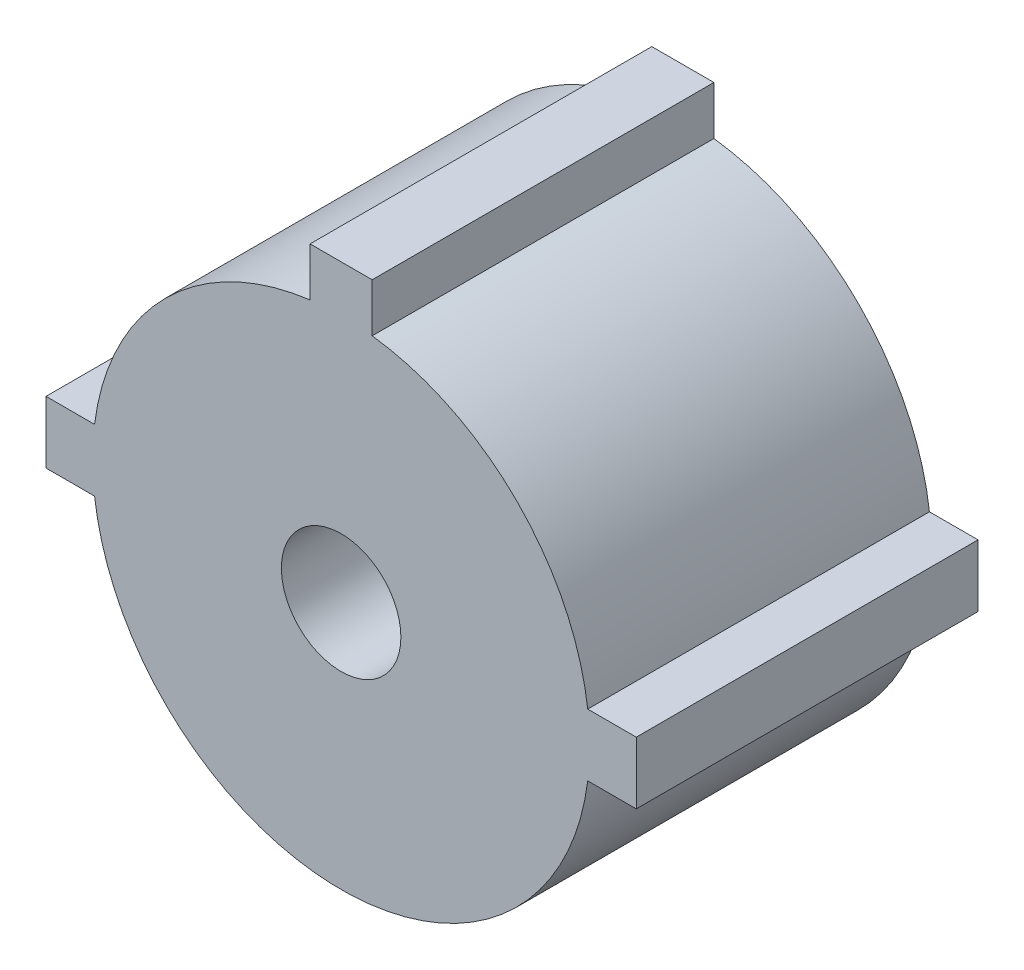
ISO-10303-21;
HEADER;
FILE_DESCRIPTION(('STEP AP214'),'2;1');
FILE_NAME('part.step','',(''),(''),'','','');
FILE_SCHEMA(('AUTOMOTIVE_DESIGN { 1 0 10303 214 1 1 1 1 }'));
ENDSEC;
DATA;
#1=APPLICATION_CONTEXT('core data for automotive mechanical design processes');
#2=APPLICATION_PROTOCOL_DEFINITION('international standard','automotive_design',2000,#1);
#3=PRODUCT_CONTEXT('',#1,'mechanical');
#4=PRODUCT('Part','Part','',(#3));
#5=PRODUCT_RELATED_PRODUCT_CATEGORY('part','',(#4));
#6=PRODUCT_DEFINITION_FORMATION('','',#4);
#7=PRODUCT_DEFINITION_CONTEXT('part definition',#1,'design');
#8=PRODUCT_DEFINITION('design','',#6,#7);
#9=PRODUCT_DEFINITION_SHAPE('','',#8);
#10=(LENGTH_UNIT() NAMED_UNIT(*) SI_UNIT(.MILLI.,.METRE.));
#11=(NAMED_UNIT(*) PLANE_ANGLE_UNIT() SI_UNIT($,.RADIAN.));
#12=(NAMED_UNIT(*) SI_UNIT($,.STERADIAN.) SOLID_ANGLE_UNIT());
#13=UNCERTAINTY_MEASURE_WITH_UNIT(LENGTH_MEASURE(1.E-05),#10,'distance_accuracy_value','');
#14=(GEOMETRIC_REPRESENTATION_CONTEXT(3) GLOBAL_UNCERTAINTY_ASSIGNED_CONTEXT((#13)) GLOBAL_UNIT_ASSIGNED_CONTEXT((#10,
#11,#12)) REPRESENTATION_CONTEXT('',''));
#15=CARTESIAN_POINT('',(0.,0.,0.));
#16=DIRECTION('',(0.,0.,1.));
#17=DIRECTION('',(1.,0.,0.));
#18=AXIS2_PLACEMENT_3D('',#15,#16,#17);
#19=CARTESIAN_POINT('',(0.,0.,5.5));
#20=DIRECTION('',(0.,0.,-1.));
#21=DIRECTION('',(-1.,0.,0.));
#22=AXIS2_PLACEMENT_3D('',#19,#20,#21);
#23=CYLINDRICAL_SURFACE('',#22,4.);
#24=CARTESIAN_POINT('',(0.,0.,0.));
#25=DIRECTION('',(0.,0.,1.));
#26=DIRECTION('',(1.,0.,0.));
#27=AXIS2_PLACEMENT_3D('',#24,#25,#26);
#28=CIRCLE('',#27,4.);
#29=CARTESIAN_POINT('',(-0.5,3.96862696659689,0.));
#30=VERTEX_POINT('',#29);
#31=CARTESIAN_POINT('',(-3.96862696659689,0.5,0.));
#32=VERTEX_POINT('',#31);
#33=EDGE_CURVE('E157',#30,#32,#28,.T.);
#34=ORIENTED_EDGE('',*,*,#33,.T.);
#35=DIRECTION('',(0.,0.,-1.));
#36=VECTOR('',#35,1.);
#37=CARTESIAN_POINT('',(-3.96862696659689,0.5,5.5));
#38=LINE('',#37,#36);
#39=CARTESIAN_POINT('',(-3.96862696659689,0.5,5.5));
#40=VERTEX_POINT('',#39);
#41=EDGE_CURVE('E11',#40,#32,#38,.T.);
#42=ORIENTED_EDGE('',*,*,#41,.F.);
#43=CARTESIAN_POINT('',(0.,0.,5.5));
#44=DIRECTION('',(0.,0.,1.));
#45=DIRECTION('',(1.,0.,0.));
#46=AXIS2_PLACEMENT_3D('',#43,#44,#45);
#47=CIRCLE('',#46,4.);
#48=CARTESIAN_POINT('',(-0.5,3.96862696659689,5.5));
#49=VERTEX_POINT('',#48);
#50=EDGE_CURVE('E100',#49,#40,#47,.T.);
#51=ORIENTED_EDGE('',*,*,#50,.F.);
#52=DIRECTION('',(0.,0.,-1.));
#53=VECTOR('',#52,1.);
#54=CARTESIAN_POINT('',(-0.5,3.96862696659689,5.5));
#55=LINE('',#54,#53);
#56=EDGE_CURVE('E150',#49,#30,#55,.T.);
#57=ORIENTED_EDGE('',*,*,#56,.T.);
#58=EDGE_LOOP('',(#34,#42,#51,#57));
#59=FACE_BOUND('',#58,.T.);
#60=ADVANCED_FACE('F35',(#59),#23,.T.);
#61=CARTESIAN_POINT('',(0.,0.5,5.5));
#62=DIRECTION('',(0.,1.,0.));
#63=DIRECTION('',(0.,0.,1.));
#64=AXIS2_PLACEMENT_3D('',#61,#62,#63);
#65=PLANE('',#64);
#66=DIRECTION('',(1.,0.,0.));
#67=VECTOR('',#66,1.);
#68=CARTESIAN_POINT('',(0.,0.5,0.));
#69=LINE('',#68,#67);
#70=CARTESIAN_POINT('',(-4.75,0.5,0.));
#71=VERTEX_POINT('',#70);
#72=EDGE_CURVE('E160',#71,#32,#69,.T.);
#73=ORIENTED_EDGE('',*,*,#72,.F.);
#74=DIRECTION('',(0.,0.,-1.));
#75=VECTOR('',#74,1.);
#76=CARTESIAN_POINT('',(-4.75,0.5,5.5));
#77=LINE('',#76,#75);
#78=CARTESIAN_POINT('',(-4.75,0.5,5.5));
#79=VERTEX_POINT('',#78);
#80=EDGE_CURVE('E44',#79,#71,#77,.T.);
#81=ORIENTED_EDGE('',*,*,#80,.F.);
#82=DIRECTION('',(1.,0.,0.));
#83=VECTOR('',#82,1.);
#84=CARTESIAN_POINT('',(0.,0.5,5.5));
#85=LINE('',#84,#83);
#86=EDGE_CURVE('E218',#79,#40,#85,.T.);
#87=ORIENTED_EDGE('',*,*,#86,.T.);
#88=ORIENTED_EDGE('',*,*,#41,.T.);
#89=EDGE_LOOP('',(#73,#81,#87,#88));
#90=FACE_BOUND('',#89,.T.);
#91=ADVANCED_FACE('F217',(#90),#65,.T.);
#92=CARTESIAN_POINT('',(-4.75,0.,5.5));
#93=DIRECTION('',(1.,0.,0.));
#94=DIRECTION('',(0.,0.,-1.));
#95=AXIS2_PLACEMENT_3D('',#92,#93,#94);
#96=PLANE('',#95);
#97=DIRECTION('',(0.,-1.,0.));
#98=VECTOR('',#97,1.);
#99=CARTESIAN_POINT('',(-4.75,0.,0.));
#100=LINE('',#99,#98);
#101=CARTESIAN_POINT('',(-4.75,-0.5,0.));
#102=VERTEX_POINT('',#101);
#103=EDGE_CURVE('E163',#71,#102,#100,.T.);
#104=ORIENTED_EDGE('',*,*,#103,.T.);
#105=DIRECTION('',(0.,0.,-1.));
#106=VECTOR('',#105,1.);
#107=CARTESIAN_POINT('',(-4.75,-0.5,5.5));
#108=LINE('',#107,#106);
#109=CARTESIAN_POINT('',(-4.75,-0.5,5.5));
#110=VERTEX_POINT('',#109);
#111=EDGE_CURVE('E201',#110,#102,#108,.T.);
#112=ORIENTED_EDGE('',*,*,#111,.F.);
#113=DIRECTION('',(0.,-1.,0.));
#114=VECTOR('',#113,1.);
#115=CARTESIAN_POINT('',(-4.75,0.,5.5));
#116=LINE('',#115,#114);
#117=EDGE_CURVE('E208',#79,#110,#116,.T.);
#118=ORIENTED_EDGE('',*,*,#117,.F.);
#119=ORIENTED_EDGE('',*,*,#80,.T.);
#120=EDGE_LOOP('',(#104,#112,#118,#119));
#121=FACE_BOUND('',#120,.T.);
#122=ADVANCED_FACE('F206',(#121),#96,.F.);
#123=CARTESIAN_POINT('',(0.,-0.5,5.5));
#124=DIRECTION('',(0.,1.,0.));
#125=DIRECTION('',(0.,0.,1.));
#126=AXIS2_PLACEMENT_3D('',#123,#124,#125);
#127=PLANE('',#126);
#128=DIRECTION('',(1.,0.,0.));
#129=VECTOR('',#128,1.);
#130=CARTESIAN_POINT('',(0.,-0.5,0.));
#131=LINE('',#130,#129);
#132=CARTESIAN_POINT('',(-3.96862696659689,-0.5,0.));
#133=VERTEX_POINT('',#132);
#134=EDGE_CURVE('E165',#102,#133,#131,.T.);
#135=ORIENTED_EDGE('',*,*,#134,.T.);
#136=DIRECTION('',(0.,0.,-1.));
#137=VECTOR('',#136,1.);
#138=CARTESIAN_POINT('',(-3.96862696659689,-0.5,5.5));
#139=LINE('',#138,#137);
#140=CARTESIAN_POINT('',(-3.96862696659689,-0.5,5.5));
#141=VERTEX_POINT('',#140);
#142=EDGE_CURVE('E198',#141,#133,#139,.T.);
#143=ORIENTED_EDGE('',*,*,#142,.F.);
#144=DIRECTION('',(1.,0.,0.));
#145=VECTOR('',#144,1.);
#146=CARTESIAN_POINT('',(0.,-0.5,5.5));
#147=LINE('',#146,#145);
#148=EDGE_CURVE('E247',#110,#141,#147,.T.);
#149=ORIENTED_EDGE('',*,*,#148,.F.);
#150=ORIENTED_EDGE('',*,*,#111,.T.);
#151=EDGE_LOOP('',(#135,#143,#149,#150));
#152=FACE_BOUND('',#151,.T.);
#153=ADVANCED_FACE('F246',(#152),#127,.F.);
#154=CARTESIAN_POINT('',(0.,0.,5.5));
#155=DIRECTION('',(0.,0.,-1.));
#156=DIRECTION('',(-1.,0.,0.));
#157=AXIS2_PLACEMENT_3D('',#154,#155,#156);
#158=CYLINDRICAL_SURFACE('',#157,4.);
#159=CARTESIAN_POINT('',(0.,0.,0.));
#160=DIRECTION('',(0.,0.,1.));
#161=DIRECTION('',(1.,0.,0.));
#162=AXIS2_PLACEMENT_3D('',#159,#160,#161);
#163=CIRCLE('',#162,4.);
#164=CARTESIAN_POINT('',(3.96862696659689,-0.5,0.));
#165=VERTEX_POINT('',#164);
#166=EDGE_CURVE('E167',#133,#165,#163,.T.);
#167=ORIENTED_EDGE('',*,*,#166,.T.);
#168=DIRECTION('',(0.,0.,-1.));
#169=VECTOR('',#168,1.);
#170=CARTESIAN_POINT('',(3.96862696659689,-0.5,5.5));
#171=LINE('',#170,#169);
#172=CARTESIAN_POINT('',(3.96862696659689,-0.5,5.5));
#173=VERTEX_POINT('',#172);
#174=EDGE_CURVE('E195',#173,#165,#171,.T.);
#175=ORIENTED_EDGE('',*,*,#174,.F.);
#176=CARTESIAN_POINT('',(0.,0.,5.5));
#177=DIRECTION('',(0.,0.,1.));
#178=DIRECTION('',(1.,0.,0.));
#179=AXIS2_PLACEMENT_3D('',#176,#177,#178);
#180=CIRCLE('',#179,4.);
#181=EDGE_CURVE('E242',#141,#173,#180,.T.);
#182=ORIENTED_EDGE('',*,*,#181,.F.);
#183=ORIENTED_EDGE('',*,*,#142,.T.);
#184=EDGE_LOOP('',(#167,#175,#182,#183));
#185=FACE_BOUND('',#184,.T.);
#186=ADVANCED_FACE('F241',(#185),#158,.T.);
#187=CARTESIAN_POINT('',(0.,-0.5,5.5));
#188=DIRECTION('',(0.,1.,0.));
#189=DIRECTION('',(0.,0.,1.));
#190=AXIS2_PLACEMENT_3D('',#187,#188,#189);
#191=PLANE('',#190);
#192=DIRECTION('',(1.,0.,0.));
#193=VECTOR('',#192,1.);
#194=CARTESIAN_POINT('',(0.,-0.5,0.));
#195=LINE('',#194,#193);
#196=CARTESIAN_POINT('',(4.75,-0.5,0.));
#197=VERTEX_POINT('',#196);
#198=EDGE_CURVE('E169',#165,#197,#195,.T.);
#199=ORIENTED_EDGE('',*,*,#198,.T.);
#200=DIRECTION('',(0.,0.,-1.));
#201=VECTOR('',#200,1.);
#202=CARTESIAN_POINT('',(4.75,-0.5,5.5));
#203=LINE('',#202,#201);
#204=CARTESIAN_POINT('',(4.75,-0.5,5.5));
#205=VERTEX_POINT('',#204);
#206=EDGE_CURVE('E193',#205,#197,#203,.T.);
#207=ORIENTED_EDGE('',*,*,#206,.F.);
#208=DIRECTION('',(1.,0.,0.));
#209=VECTOR('',#208,1.);
#210=CARTESIAN_POINT('',(0.,-0.5,5.5));
#211=LINE('',#210,#209);
#212=EDGE_CURVE('E238',#173,#205,#211,.T.);
#213=ORIENTED_EDGE('',*,*,#212,.F.);
#214=ORIENTED_EDGE('',*,*,#174,.T.);
#215=EDGE_LOOP('',(#199,#207,#213,#214));
#216=FACE_BOUND('',#215,.T.);
#217=ADVANCED_FACE('F235',(#216),#191,.F.);
#218=CARTESIAN_POINT('',(4.75,0.,5.5));
#219=DIRECTION('',(1.,0.,0.));
#220=DIRECTION('',(0.,0.,-1.));
#221=AXIS2_PLACEMENT_3D('',#218,#219,#220);
#222=PLANE('',#221);
#223=DIRECTION('',(0.,-1.,0.));
#224=VECTOR('',#223,1.);
#225=CARTESIAN_POINT('',(4.75,0.,0.));
#226=LINE('',#225,#224);
#227=CARTESIAN_POINT('',(4.75,0.5,0.));
#228=VERTEX_POINT('',#227);
#229=EDGE_CURVE('E172',#228,#197,#226,.T.);
#230=ORIENTED_EDGE('',*,*,#229,.F.);
#231=DIRECTION('',(0.,0.,-1.));
#232=VECTOR('',#231,1.);
#233=CARTESIAN_POINT('',(4.75,0.5,5.5));
#234=LINE('',#233,#232);
#235=CARTESIAN_POINT('',(4.75,0.5,5.5));
#236=VERTEX_POINT('',#235);
#237=EDGE_CURVE('E191',#236,#228,#234,.T.);
#238=ORIENTED_EDGE('',*,*,#237,.F.);
#239=DIRECTION('',(0.,-1.,0.));
#240=VECTOR('',#239,1.);
#241=CARTESIAN_POINT('',(4.75,0.,5.5));
#242=LINE('',#241,#240);
#243=EDGE_CURVE('E254',#236,#205,#242,.T.);
#244=ORIENTED_EDGE('',*,*,#243,.T.);
#245=ORIENTED_EDGE('',*,*,#206,.T.);
#246=EDGE_LOOP('',(#230,#238,#244,#245));
#247=FACE_BOUND('',#246,.T.);
#248=ADVANCED_FACE('F231',(#247),#222,.T.);
#249=CARTESIAN_POINT('',(0.,0.5,5.5));
#250=DIRECTION('',(0.,1.,0.));
#251=DIRECTION('',(0.,0.,1.));
#252=AXIS2_PLACEMENT_3D('',#249,#250,#251);
#253=PLANE('',#252);
#254=DIRECTION('',(1.,0.,0.));
#255=VECTOR('',#254,1.);
#256=CARTESIAN_POINT('',(0.,0.5,0.));
#257=LINE('',#256,#255);
#258=CARTESIAN_POINT('',(3.96862696659689,0.5,0.));
#259=VERTEX_POINT('',#258);
#260=EDGE_CURVE('E175',#259,#228,#257,.T.);
#261=ORIENTED_EDGE('',*,*,#260,.F.);
#262=DIRECTION('',(0.,0.,-1.));
#263=VECTOR('',#262,1.);
#264=CARTESIAN_POINT('',(3.96862696659689,0.5,5.5));
#265=LINE('',#264,#263);
#266=CARTESIAN_POINT('',(3.96862696659689,0.5,5.5));
#267=VERTEX_POINT('',#266);
#268=EDGE_CURVE('E189',#267,#259,#265,.T.);
#269=ORIENTED_EDGE('',*,*,#268,.F.);
#270=DIRECTION('',(1.,0.,0.));
#271=VECTOR('',#270,1.);
#272=CARTESIAN_POINT('',(0.,0.5,5.5));
#273=LINE('',#272,#271);
#274=EDGE_CURVE('E227',#267,#236,#273,.T.);
#275=ORIENTED_EDGE('',*,*,#274,.T.);
#276=ORIENTED_EDGE('',*,*,#237,.T.);
#277=EDGE_LOOP('',(#261,#269,#275,#276));
#278=FACE_BOUND('',#277,.T.);
#279=ADVANCED_FACE('F224',(#278),#253,.T.);
#280=CARTESIAN_POINT('',(0.,0.,5.5));
#281=DIRECTION('',(0.,0.,-1.));
#282=DIRECTION('',(-1.,0.,0.));
#283=AXIS2_PLACEMENT_3D('',#280,#281,#282);
#284=CYLINDRICAL_SURFACE('',#283,4.);
#285=CARTESIAN_POINT('',(0.,0.,0.));
#286=DIRECTION('',(0.,0.,1.));
#287=DIRECTION('',(1.,0.,0.));
#288=AXIS2_PLACEMENT_3D('',#285,#286,#287);
#289=CIRCLE('',#288,4.);
#290=CARTESIAN_POINT('',(0.5,3.96862696659689,0.));
#291=VERTEX_POINT('',#290);
#292=EDGE_CURVE('E178',#259,#291,#289,.T.);
#293=ORIENTED_EDGE('',*,*,#292,.T.);
#294=DIRECTION('',(0.,0.,-1.));
#295=VECTOR('',#294,1.);
#296=CARTESIAN_POINT('',(0.5,3.96862696659689,5.5));
#297=LINE('',#296,#295);
#298=CARTESIAN_POINT('',(0.5,3.96862696659689,5.5));
#299=VERTEX_POINT('',#298);
#300=EDGE_CURVE('E139',#299,#291,#297,.T.);
#301=ORIENTED_EDGE('',*,*,#300,.F.);
#302=CARTESIAN_POINT('',(0.,0.,5.5));
#303=DIRECTION('',(0.,0.,1.));
#304=DIRECTION('',(1.,0.,0.));
#305=AXIS2_PLACEMENT_3D('',#302,#303,#304);
#306=CIRCLE('',#305,4.);
#307=EDGE_CURVE('E145',#267,#299,#306,.T.);
#308=ORIENTED_EDGE('',*,*,#307,.F.);
#309=ORIENTED_EDGE('',*,*,#268,.T.);
#310=EDGE_LOOP('',(#293,#301,#308,#309));
#311=FACE_BOUND('',#310,.T.);
#312=ADVANCED_FACE('F291',(#311),#284,.T.);
#313=CARTESIAN_POINT('',(0.5,0.,5.5));
#314=DIRECTION('',(1.,0.,0.));
#315=DIRECTION('',(0.,1.,0.));
#316=AXIS2_PLACEMENT_3D('',#313,#314,#315);
#317=PLANE('',#316);
#318=DIRECTION('',(0.,-1.,0.));
#319=VECTOR('',#318,1.);
#320=CARTESIAN_POINT('',(0.5,0.,0.));
#321=LINE('',#320,#319);
#322=CARTESIAN_POINT('',(0.5,4.75,0.));
#323=VERTEX_POINT('',#322);
#324=EDGE_CURVE('E134',#323,#291,#321,.T.);
#325=ORIENTED_EDGE('',*,*,#324,.F.);
#326=DIRECTION('',(0.,0.,-1.));
#327=VECTOR('',#326,1.);
#328=CARTESIAN_POINT('',(0.5,4.75,5.5));
#329=LINE('',#328,#327);
#330=CARTESIAN_POINT('',(0.5,4.75,5.5));
#331=VERTEX_POINT('',#330);
#332=EDGE_CURVE('E129',#331,#323,#329,.T.);
#333=ORIENTED_EDGE('',*,*,#332,.F.);
#334=DIRECTION('',(0.,-1.,0.));
#335=VECTOR('',#334,1.);
#336=CARTESIAN_POINT('',(0.5,0.,5.5));
#337=LINE('',#336,#335);
#338=EDGE_CURVE('E132',#331,#299,#337,.T.);
#339=ORIENTED_EDGE('',*,*,#338,.T.);
#340=ORIENTED_EDGE('',*,*,#300,.T.);
#341=EDGE_LOOP('',(#325,#333,#339,#340));
#342=FACE_BOUND('',#341,.T.);
#343=ADVANCED_FACE('F131',(#342),#317,.T.);
#344=CARTESIAN_POINT('',(0.,4.75,5.5));
#345=DIRECTION('',(0.,1.,0.));
#346=DIRECTION('',(-1.,0.,0.));
#347=AXIS2_PLACEMENT_3D('',#344,#345,#346);
#348=PLANE('',#347);
#349=DIRECTION('',(1.,0.,0.));
#350=VECTOR('',#349,1.);
#351=CARTESIAN_POINT('',(0.,4.75,0.));
#352=LINE('',#351,#350);
#353=CARTESIAN_POINT('',(-0.5,4.75,0.));
#354=VERTEX_POINT('',#353);
#355=EDGE_CURVE('E182',#354,#323,#352,.T.);
#356=ORIENTED_EDGE('',*,*,#355,.F.);
#357=DIRECTION('',(0.,0.,-1.));
#358=VECTOR('',#357,1.);
#359=CARTESIAN_POINT('',(-0.5,4.75,5.5));
#360=LINE('',#359,#358);
#361=CARTESIAN_POINT('',(-0.5,4.75,5.5));
#362=VERTEX_POINT('',#361);
#363=EDGE_CURVE('E91',#362,#354,#360,.T.);
#364=ORIENTED_EDGE('',*,*,#363,.F.);
#365=DIRECTION('',(1.,0.,0.));
#366=VECTOR('',#365,1.);
#367=CARTESIAN_POINT('',(0.,4.75,5.5));
#368=LINE('',#367,#366);
#369=EDGE_CURVE('E142',#362,#331,#368,.T.);
#370=ORIENTED_EDGE('',*,*,#369,.T.);
#371=ORIENTED_EDGE('',*,*,#332,.T.);
#372=EDGE_LOOP('',(#356,#364,#370,#371));
#373=FACE_BOUND('',#372,.T.);
#374=ADVANCED_FACE('F148',(#373),#348,.T.);
#375=CARTESIAN_POINT('',(0.,0.,5.5));
#376=DIRECTION('',(0.,0.,-1.));
#377=DIRECTION('',(-1.,0.,0.));
#378=AXIS2_PLACEMENT_3D('',#375,#376,#377);
#379=CYLINDRICAL_SURFACE('',#378,0.961590007957688);
#380=CARTESIAN_POINT('',(0.,0.,5.5));
#381=DIRECTION('',(0.,0.,1.));
#382=DIRECTION('',(1.,0.,0.));
#383=AXIS2_PLACEMENT_3D('',#380,#381,#382);
#384=CIRCLE('',#383,0.961590007957688);
#385=CARTESIAN_POINT('',(0.961590007957688,0.,5.5));
#386=VERTEX_POINT('',#385);
#387=EDGE_CURVE('E185',#386,#386,#384,.T.);
#388=ORIENTED_EDGE('',*,*,#387,.T.);
#389=EDGE_LOOP('',(#388));
#390=FACE_BOUND('',#389,.T.);
#391=CARTESIAN_POINT('',(0.,0.,0.));
#392=DIRECTION('',(0.,0.,1.));
#393=DIRECTION('',(1.,0.,0.));
#394=AXIS2_PLACEMENT_3D('',#391,#392,#393);
#395=CIRCLE('',#394,0.961590007957688);
#396=CARTESIAN_POINT('',(0.961590007957688,0.,0.));
#397=VERTEX_POINT('',#396);
#398=EDGE_CURVE('E154',#397,#397,#395,.T.);
#399=ORIENTED_EDGE('',*,*,#398,.F.);
#400=EDGE_LOOP('',(#399));
#401=FACE_BOUND('',#400,.T.);
#402=ADVANCED_FACE('F37',(#390,#401),#379,.F.);
#403=CARTESIAN_POINT('',(-0.5,0.,5.5));
#404=DIRECTION('',(1.,0.,0.));
#405=DIRECTION('',(0.,1.,0.));
#406=AXIS2_PLACEMENT_3D('',#403,#404,#405);
#407=PLANE('',#406);
#408=DIRECTION('',(0.,-1.,0.));
#409=VECTOR('',#408,1.);
#410=CARTESIAN_POINT('',(-0.5,0.,0.));
#411=LINE('',#410,#409);
#412=EDGE_CURVE('E94',#354,#30,#411,.T.);
#413=ORIENTED_EDGE('',*,*,#412,.T.);
#414=ORIENTED_EDGE('',*,*,#56,.F.);
#415=DIRECTION('',(0.,-1.,0.));
#416=VECTOR('',#415,1.);
#417=CARTESIAN_POINT('',(-0.5,0.,5.5));
#418=LINE('',#417,#416);
#419=EDGE_CURVE('E52',#362,#49,#418,.T.);
#420=ORIENTED_EDGE('',*,*,#419,.F.);
#421=ORIENTED_EDGE('',*,*,#363,.T.);
#422=EDGE_LOOP('',(#413,#414,#420,#421));
#423=FACE_BOUND('',#422,.T.);
#424=ADVANCED_FACE('F264',(#423),#407,.F.);
#425=CARTESIAN_POINT('',(0.,0.,5.5));
#426=DIRECTION('',(0.,0.,1.));
#427=DIRECTION('',(1.,0.,0.));
#428=AXIS2_PLACEMENT_3D('',#425,#426,#427);
#429=PLANE('',#428);
#430=ORIENTED_EDGE('',*,*,#387,.F.);
#431=EDGE_LOOP('',(#430));
#432=FACE_BOUND('',#431,.T.);
#433=ORIENTED_EDGE('',*,*,#50,.T.);
#434=ORIENTED_EDGE('',*,*,#86,.F.);
#435=ORIENTED_EDGE('',*,*,#117,.T.);
#436=ORIENTED_EDGE('',*,*,#148,.T.);
#437=ORIENTED_EDGE('',*,*,#181,.T.);
#438=ORIENTED_EDGE('',*,*,#212,.T.);
#439=ORIENTED_EDGE('',*,*,#243,.F.);
#440=ORIENTED_EDGE('',*,*,#274,.F.);
#441=ORIENTED_EDGE('',*,*,#307,.T.);
#442=ORIENTED_EDGE('',*,*,#338,.F.);
#443=ORIENTED_EDGE('',*,*,#369,.F.);
#444=ORIENTED_EDGE('',*,*,#419,.T.);
#445=EDGE_LOOP('',(#433,#434,#435,#436,#437,#438,#439,#440,#441,#442,#443,#444));
#446=FACE_BOUND('',#445,.T.);
#447=ADVANCED_FACE('F141',(#432,#446),#429,.T.);
#448=CARTESIAN_POINT('',(0.,0.,0.));
#449=DIRECTION('',(0.,0.,1.));
#450=DIRECTION('',(1.,0.,0.));
#451=AXIS2_PLACEMENT_3D('',#448,#449,#450);
#452=PLANE('',#451);
#453=ORIENTED_EDGE('',*,*,#398,.T.);
#454=EDGE_LOOP('',(#453));
#455=FACE_BOUND('',#454,.T.);
#456=ORIENTED_EDGE('',*,*,#33,.F.);
#457=ORIENTED_EDGE('',*,*,#412,.F.);
#458=ORIENTED_EDGE('',*,*,#355,.T.);
#459=ORIENTED_EDGE('',*,*,#324,.T.);
#460=ORIENTED_EDGE('',*,*,#292,.F.);
#461=ORIENTED_EDGE('',*,*,#260,.T.);
#462=ORIENTED_EDGE('',*,*,#229,.T.);
#463=ORIENTED_EDGE('',*,*,#198,.F.);
#464=ORIENTED_EDGE('',*,*,#166,.F.);
#465=ORIENTED_EDGE('',*,*,#134,.F.);
#466=ORIENTED_EDGE('',*,*,#103,.F.);
#467=ORIENTED_EDGE('',*,*,#72,.T.);
#468=EDGE_LOOP('',(#456,#457,#458,#459,#460,#461,#462,#463,#464,#465,#466,#467));
#469=FACE_BOUND('',#468,.T.);
#470=ADVANCED_FACE('F215',(#455,#469),#452,.F.);
#471=CLOSED_SHELL('',(#60,#91,#122,#153,#186,#217,#248,#279,#312,#343,#374,#402,#424,#447,#470));
#472=MANIFOLD_SOLID_BREP('B2',#471);
#473=ADVANCED_BREP_SHAPE_REPRESENTATION('',(#18,#472),#14);
#474=SHAPE_DEFINITION_REPRESENTATION(#9,#473);
ENDSEC;
END-ISO-10303-21;
